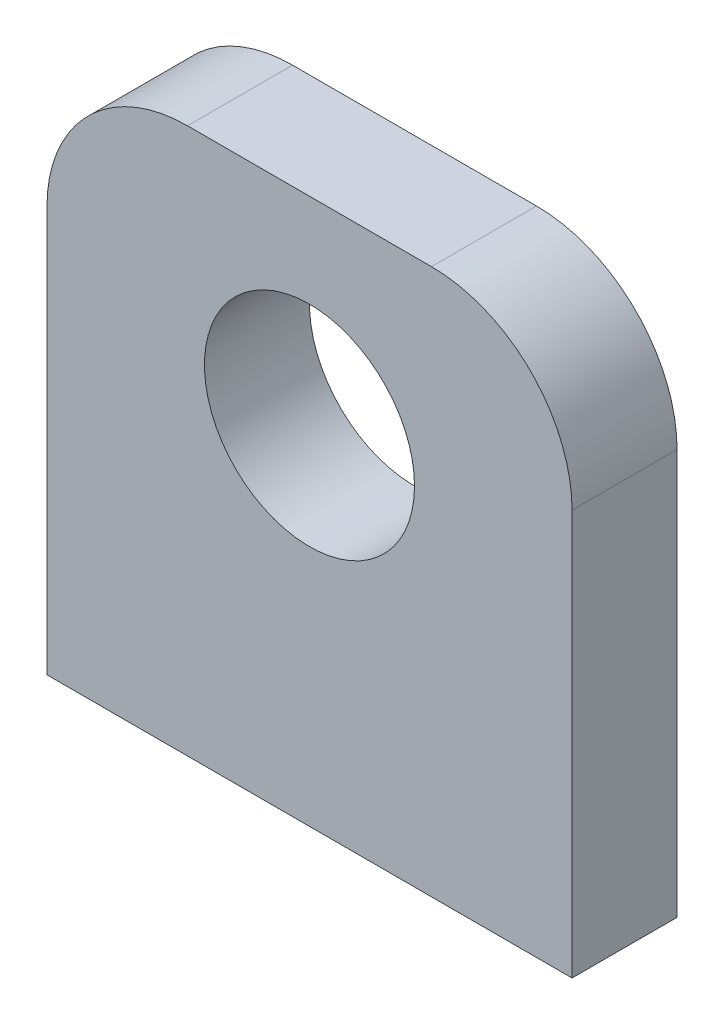
ISO-10303-21;
HEADER;
FILE_DESCRIPTION(('STEP AP214'),'2;1');
FILE_NAME('part.step','',(''),(''),'','','');
FILE_SCHEMA(('AUTOMOTIVE_DESIGN { 1 0 10303 214 1 1 1 1 }'));
ENDSEC;
DATA;
#1=APPLICATION_CONTEXT('core data for automotive mechanical design processes');
#2=APPLICATION_PROTOCOL_DEFINITION('international standard','automotive_design',2000,#1);
#3=PRODUCT_CONTEXT('',#1,'mechanical');
#4=PRODUCT('Part','Part','',(#3));
#5=PRODUCT_RELATED_PRODUCT_CATEGORY('part','',(#4));
#6=PRODUCT_DEFINITION_FORMATION('','',#4);
#7=PRODUCT_DEFINITION_CONTEXT('part definition',#1,'design');
#8=PRODUCT_DEFINITION('design','',#6,#7);
#9=PRODUCT_DEFINITION_SHAPE('','',#8);
#10=(LENGTH_UNIT() NAMED_UNIT(*) SI_UNIT(.MILLI.,.METRE.));
#11=(NAMED_UNIT(*) PLANE_ANGLE_UNIT() SI_UNIT($,.RADIAN.));
#12=(NAMED_UNIT(*) SI_UNIT($,.STERADIAN.) SOLID_ANGLE_UNIT());
#13=UNCERTAINTY_MEASURE_WITH_UNIT(LENGTH_MEASURE(1.E-05),#10,'distance_accuracy_value','');
#14=(GEOMETRIC_REPRESENTATION_CONTEXT(3) GLOBAL_UNCERTAINTY_ASSIGNED_CONTEXT((#13)) GLOBAL_UNIT_ASSIGNED_CONTEXT((#10,
#11,#12)) REPRESENTATION_CONTEXT('',''));
#15=CARTESIAN_POINT('',(0.,0.,0.));
#16=DIRECTION('',(0.,0.,1.));
#17=DIRECTION('',(1.,0.,0.));
#18=AXIS2_PLACEMENT_3D('',#15,#16,#17);
#19=CARTESIAN_POINT('',(0.,0.,12.7));
#20=DIRECTION('',(0.,0.,-1.));
#21=DIRECTION('',(-1.,0.,0.));
#22=AXIS2_PLACEMENT_3D('',#19,#20,#21);
#23=PLANE('',#22);
#24=DIRECTION('',(0.,1.,0.));
#25=VECTOR('',#24,1.);
#26=CARTESIAN_POINT('',(63.5,0.,12.7));
#27=LINE('',#26,#25);
#28=CARTESIAN_POINT('',(63.5,0.,12.7));
#29=VERTEX_POINT('',#28);
#30=CARTESIAN_POINT('',(63.5,49.,12.7));
#31=VERTEX_POINT('',#30);
#32=EDGE_CURVE('E103',#29,#31,#27,.T.);
#33=ORIENTED_EDGE('',*,*,#32,.T.);
#34=CARTESIAN_POINT('',(46.5,49.,12.7));
#35=DIRECTION('',(0.,0.,-1.));
#36=DIRECTION('',(-1.,0.,0.));
#37=AXIS2_PLACEMENT_3D('',#34,#35,#36);
#38=CIRCLE('',#37,17.);
#39=CARTESIAN_POINT('',(46.5,66.,12.7));
#40=VERTEX_POINT('',#39);
#41=EDGE_CURVE('E42',#31,#40,#38,.F.);
#42=ORIENTED_EDGE('',*,*,#41,.T.);
#43=DIRECTION('',(-1.,0.,0.));
#44=VECTOR('',#43,1.);
#45=CARTESIAN_POINT('',(0.,66.,12.7));
#46=LINE('',#45,#44);
#47=CARTESIAN_POINT('',(17.,66.,12.7));
#48=VERTEX_POINT('',#47);
#49=EDGE_CURVE('E113',#40,#48,#46,.T.);
#50=ORIENTED_EDGE('',*,*,#49,.T.);
#51=CARTESIAN_POINT('',(17.,49.,12.7));
#52=DIRECTION('',(0.,0.,-1.));
#53=DIRECTION('',(-1.,0.,0.));
#54=AXIS2_PLACEMENT_3D('',#51,#52,#53);
#55=CIRCLE('',#54,17.);
#56=CARTESIAN_POINT('',(0.,49.,12.7));
#57=VERTEX_POINT('',#56);
#58=EDGE_CURVE('E49',#48,#57,#55,.F.);
#59=ORIENTED_EDGE('',*,*,#58,.T.);
#60=DIRECTION('',(0.,-1.,0.));
#61=VECTOR('',#60,1.);
#62=CARTESIAN_POINT('',(0.,0.,12.7));
#63=LINE('',#62,#61);
#64=CARTESIAN_POINT('',(0.,0.,12.7));
#65=VERTEX_POINT('',#64);
#66=EDGE_CURVE('E87',#57,#65,#63,.T.);
#67=ORIENTED_EDGE('',*,*,#66,.T.);
#68=DIRECTION('',(1.,0.,0.));
#69=VECTOR('',#68,1.);
#70=CARTESIAN_POINT('',(0.,0.,12.7));
#71=LINE('',#70,#69);
#72=EDGE_CURVE('E90',#65,#29,#71,.T.);
#73=ORIENTED_EDGE('',*,*,#72,.T.);
#74=EDGE_LOOP('',(#33,#42,#50,#59,#67,#73));
#75=FACE_BOUND('',#74,.T.);
#76=CARTESIAN_POINT('',(31.75,42.,12.7));
#77=DIRECTION('',(0.,0.,1.));
#78=DIRECTION('',(1.,0.,0.));
#79=AXIS2_PLACEMENT_3D('',#76,#77,#78);
#80=CIRCLE('',#79,12.7);
#81=CARTESIAN_POINT('',(44.45,42.,12.7));
#82=VERTEX_POINT('',#81);
#83=EDGE_CURVE('E145',#82,#82,#80,.T.);
#84=ORIENTED_EDGE('',*,*,#83,.F.);
#85=EDGE_LOOP('',(#84));
#86=FACE_BOUND('',#85,.T.);
#87=ADVANCED_FACE('F34',(#75,#86),#23,.F.);
#88=CARTESIAN_POINT('',(0.,0.,0.));
#89=DIRECTION('',(0.,0.,-1.));
#90=DIRECTION('',(-1.,0.,0.));
#91=AXIS2_PLACEMENT_3D('',#88,#89,#90);
#92=PLANE('',#91);
#93=DIRECTION('',(-1.,0.,0.));
#94=VECTOR('',#93,1.);
#95=CARTESIAN_POINT('',(0.,66.,0.));
#96=LINE('',#95,#94);
#97=CARTESIAN_POINT('',(46.5,66.,0.));
#98=VERTEX_POINT('',#97);
#99=CARTESIAN_POINT('',(17.,66.,0.));
#100=VERTEX_POINT('',#99);
#101=EDGE_CURVE('E95',#98,#100,#96,.T.);
#102=ORIENTED_EDGE('',*,*,#101,.F.);
#103=CARTESIAN_POINT('',(46.5,49.,0.));
#104=DIRECTION('',(0.,0.,-1.));
#105=DIRECTION('',(-1.,0.,0.));
#106=AXIS2_PLACEMENT_3D('',#103,#104,#105);
#107=CIRCLE('',#106,17.);
#108=CARTESIAN_POINT('',(63.5,49.,0.));
#109=VERTEX_POINT('',#108);
#110=EDGE_CURVE('E121',#98,#109,#107,.T.);
#111=ORIENTED_EDGE('',*,*,#110,.T.);
#112=DIRECTION('',(0.,1.,0.));
#113=VECTOR('',#112,1.);
#114=CARTESIAN_POINT('',(63.5,0.,0.));
#115=LINE('',#114,#113);
#116=CARTESIAN_POINT('',(63.5,0.,0.));
#117=VERTEX_POINT('',#116);
#118=EDGE_CURVE('E139',#117,#109,#115,.T.);
#119=ORIENTED_EDGE('',*,*,#118,.F.);
#120=DIRECTION('',(1.,0.,0.));
#121=VECTOR('',#120,1.);
#122=CARTESIAN_POINT('',(0.,0.,0.));
#123=LINE('',#122,#121);
#124=CARTESIAN_POINT('',(0.,0.,0.));
#125=VERTEX_POINT('',#124);
#126=EDGE_CURVE('E141',#125,#117,#123,.T.);
#127=ORIENTED_EDGE('',*,*,#126,.F.);
#128=DIRECTION('',(0.,-1.,0.));
#129=VECTOR('',#128,1.);
#130=CARTESIAN_POINT('',(0.,0.,0.));
#131=LINE('',#130,#129);
#132=CARTESIAN_POINT('',(0.,49.,0.));
#133=VERTEX_POINT('',#132);
#134=EDGE_CURVE('E107',#133,#125,#131,.T.);
#135=ORIENTED_EDGE('',*,*,#134,.F.);
#136=CARTESIAN_POINT('',(17.,49.,0.));
#137=DIRECTION('',(0.,0.,-1.));
#138=DIRECTION('',(-1.,0.,0.));
#139=AXIS2_PLACEMENT_3D('',#136,#137,#138);
#140=CIRCLE('',#139,17.);
#141=EDGE_CURVE('E119',#133,#100,#140,.T.);
#142=ORIENTED_EDGE('',*,*,#141,.T.);
#143=EDGE_LOOP('',(#102,#111,#119,#127,#135,#142));
#144=FACE_BOUND('',#143,.T.);
#145=CARTESIAN_POINT('',(31.75,42.,0.));
#146=DIRECTION('',(0.,0.,1.));
#147=DIRECTION('',(1.,0.,0.));
#148=AXIS2_PLACEMENT_3D('',#145,#146,#147);
#149=CIRCLE('',#148,12.7);
#150=CARTESIAN_POINT('',(44.45,42.,0.));
#151=VERTEX_POINT('',#150);
#152=EDGE_CURVE('E148',#151,#151,#149,.T.);
#153=ORIENTED_EDGE('',*,*,#152,.T.);
#154=EDGE_LOOP('',(#153));
#155=FACE_BOUND('',#154,.T.);
#156=ADVANCED_FACE('F137',(#144,#155),#92,.T.);
#157=CARTESIAN_POINT('',(0.,0.,12.7));
#158=DIRECTION('',(1.,0.,0.));
#159=DIRECTION('',(0.,0.,-1.));
#160=AXIS2_PLACEMENT_3D('',#157,#158,#159);
#161=PLANE('',#160);
#162=ORIENTED_EDGE('',*,*,#66,.F.);
#163=DIRECTION('',(0.,0.,-1.));
#164=VECTOR('',#163,1.);
#165=CARTESIAN_POINT('',(0.,49.,12.7));
#166=LINE('',#165,#164);
#167=EDGE_CURVE('E11',#57,#133,#166,.T.);
#168=ORIENTED_EDGE('',*,*,#167,.T.);
#169=ORIENTED_EDGE('',*,*,#134,.T.);
#170=DIRECTION('',(0.,0.,-1.));
#171=VECTOR('',#170,1.);
#172=CARTESIAN_POINT('',(0.,0.,12.7));
#173=LINE('',#172,#171);
#174=EDGE_CURVE('E100',#65,#125,#173,.T.);
#175=ORIENTED_EDGE('',*,*,#174,.F.);
#176=EDGE_LOOP('',(#162,#168,#169,#175));
#177=FACE_BOUND('',#176,.T.);
#178=ADVANCED_FACE('F105',(#177),#161,.F.);
#179=CARTESIAN_POINT('',(0.,0.,12.7));
#180=DIRECTION('',(0.,1.,0.));
#181=DIRECTION('',(0.,0.,1.));
#182=AXIS2_PLACEMENT_3D('',#179,#180,#181);
#183=PLANE('',#182);
#184=ORIENTED_EDGE('',*,*,#126,.T.);
#185=DIRECTION('',(0.,0.,-1.));
#186=VECTOR('',#185,1.);
#187=CARTESIAN_POINT('',(63.5,0.,12.7));
#188=LINE('',#187,#186);
#189=EDGE_CURVE('E102',#29,#117,#188,.T.);
#190=ORIENTED_EDGE('',*,*,#189,.F.);
#191=ORIENTED_EDGE('',*,*,#72,.F.);
#192=ORIENTED_EDGE('',*,*,#174,.T.);
#193=EDGE_LOOP('',(#184,#190,#191,#192));
#194=FACE_BOUND('',#193,.T.);
#195=ADVANCED_FACE('F99',(#194),#183,.F.);
#196=CARTESIAN_POINT('',(63.5,0.,12.7));
#197=DIRECTION('',(-1.,0.,0.));
#198=DIRECTION('',(0.,0.,1.));
#199=AXIS2_PLACEMENT_3D('',#196,#197,#198);
#200=PLANE('',#199);
#201=ORIENTED_EDGE('',*,*,#118,.T.);
#202=DIRECTION('',(0.,0.,-1.));
#203=VECTOR('',#202,1.);
#204=CARTESIAN_POINT('',(63.5,49.,12.7));
#205=LINE('',#204,#203);
#206=EDGE_CURVE('E57',#109,#31,#205,.F.);
#207=ORIENTED_EDGE('',*,*,#206,.T.);
#208=ORIENTED_EDGE('',*,*,#32,.F.);
#209=ORIENTED_EDGE('',*,*,#189,.T.);
#210=EDGE_LOOP('',(#201,#207,#208,#209));
#211=FACE_BOUND('',#210,.T.);
#212=ADVANCED_FACE('F140',(#211),#200,.F.);
#213=CARTESIAN_POINT('',(0.,66.,12.7));
#214=DIRECTION('',(0.,-1.,0.));
#215=DIRECTION('',(0.,0.,-1.));
#216=AXIS2_PLACEMENT_3D('',#213,#214,#215);
#217=PLANE('',#216);
#218=ORIENTED_EDGE('',*,*,#49,.F.);
#219=DIRECTION('',(0.,0.,-1.));
#220=VECTOR('',#219,1.);
#221=CARTESIAN_POINT('',(46.5,66.,12.7));
#222=LINE('',#221,#220);
#223=EDGE_CURVE('E111',#40,#98,#222,.T.);
#224=ORIENTED_EDGE('',*,*,#223,.T.);
#225=ORIENTED_EDGE('',*,*,#101,.T.);
#226=DIRECTION('',(0.,0.,-1.));
#227=VECTOR('',#226,1.);
#228=CARTESIAN_POINT('',(17.,66.,12.7));
#229=LINE('',#228,#227);
#230=EDGE_CURVE('E109',#100,#48,#229,.F.);
#231=ORIENTED_EDGE('',*,*,#230,.T.);
#232=EDGE_LOOP('',(#218,#224,#225,#231));
#233=FACE_BOUND('',#232,.T.);
#234=ADVANCED_FACE('F129',(#233),#217,.F.);
#235=CARTESIAN_POINT('',(31.75,42.,12.7));
#236=DIRECTION('',(0.,0.,-1.));
#237=DIRECTION('',(-1.,0.,0.));
#238=AXIS2_PLACEMENT_3D('',#235,#236,#237);
#239=CYLINDRICAL_SURFACE('',#238,12.7);
#240=ORIENTED_EDGE('',*,*,#83,.T.);
#241=EDGE_LOOP('',(#240));
#242=FACE_BOUND('',#241,.T.);
#243=ORIENTED_EDGE('',*,*,#152,.F.);
#244=EDGE_LOOP('',(#243));
#245=FACE_BOUND('',#244,.T.);
#246=ADVANCED_FACE('F154',(#242,#245),#239,.F.);
#247=CARTESIAN_POINT('',(46.5,49.,12.7));
#248=DIRECTION('',(0.,0.,-1.));
#249=DIRECTION('',(-1.,0.,0.));
#250=AXIS2_PLACEMENT_3D('',#247,#248,#249);
#251=CYLINDRICAL_SURFACE('',#250,17.);
#252=ORIENTED_EDGE('',*,*,#41,.F.);
#253=ORIENTED_EDGE('',*,*,#206,.F.);
#254=ORIENTED_EDGE('',*,*,#110,.F.);
#255=ORIENTED_EDGE('',*,*,#223,.F.);
#256=EDGE_LOOP('',(#252,#253,#254,#255));
#257=FACE_BOUND('',#256,.T.);
#258=ADVANCED_FACE('F134',(#257),#251,.T.);
#259=CARTESIAN_POINT('',(17.,49.,12.7));
#260=DIRECTION('',(0.,0.,-1.));
#261=DIRECTION('',(-1.,0.,0.));
#262=AXIS2_PLACEMENT_3D('',#259,#260,#261);
#263=CYLINDRICAL_SURFACE('',#262,17.);
#264=ORIENTED_EDGE('',*,*,#58,.F.);
#265=ORIENTED_EDGE('',*,*,#230,.F.);
#266=ORIENTED_EDGE('',*,*,#141,.F.);
#267=ORIENTED_EDGE('',*,*,#167,.F.);
#268=EDGE_LOOP('',(#264,#265,#266,#267));
#269=FACE_BOUND('',#268,.T.);
#270=ADVANCED_FACE('F36',(#269),#263,.T.);
#271=CLOSED_SHELL('',(#87,#156,#178,#195,#212,#234,#246,#258,#270));
#272=MANIFOLD_SOLID_BREP('B2',#271);
#273=ADVANCED_BREP_SHAPE_REPRESENTATION('',(#18,#272),#14);
#274=SHAPE_DEFINITION_REPRESENTATION(#9,#273);
ENDSEC;
END-ISO-10303-21;
